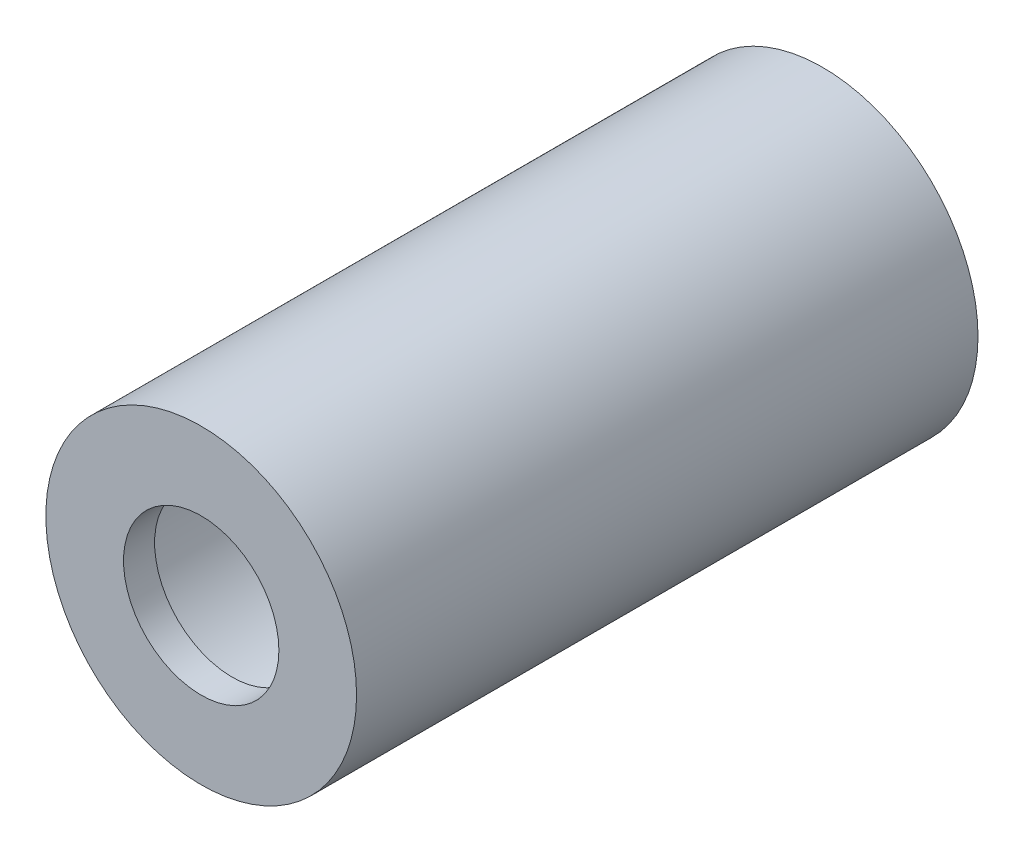
ISO-10303-21;
HEADER;
FILE_DESCRIPTION(('STEP AP214'),'2;1');
FILE_NAME('part.step','',(''),(''),'','','');
FILE_SCHEMA(('AUTOMOTIVE_DESIGN { 1 0 10303 214 1 1 1 1 }'));
ENDSEC;
DATA;
#1=APPLICATION_CONTEXT('core data for automotive mechanical design processes');
#2=APPLICATION_PROTOCOL_DEFINITION('international standard','automotive_design',2000,#1);
#3=PRODUCT_CONTEXT('',#1,'mechanical');
#4=PRODUCT('Part','Part','',(#3));
#5=PRODUCT_RELATED_PRODUCT_CATEGORY('part','',(#4));
#6=PRODUCT_DEFINITION_FORMATION('','',#4);
#7=PRODUCT_DEFINITION_CONTEXT('part definition',#1,'design');
#8=PRODUCT_DEFINITION('design','',#6,#7);
#9=PRODUCT_DEFINITION_SHAPE('','',#8);
#10=(LENGTH_UNIT() NAMED_UNIT(*) SI_UNIT(.MILLI.,.METRE.));
#11=(NAMED_UNIT(*) PLANE_ANGLE_UNIT() SI_UNIT($,.RADIAN.));
#12=(NAMED_UNIT(*) SI_UNIT($,.STERADIAN.) SOLID_ANGLE_UNIT());
#13=UNCERTAINTY_MEASURE_WITH_UNIT(LENGTH_MEASURE(1.E-05),#10,'distance_accuracy_value','');
#14=(GEOMETRIC_REPRESENTATION_CONTEXT(3) GLOBAL_UNCERTAINTY_ASSIGNED_CONTEXT((#13)) GLOBAL_UNIT_ASSIGNED_CONTEXT((#10,
#11,#12)) REPRESENTATION_CONTEXT('',''));
#15=CARTESIAN_POINT('',(0.,0.,0.));
#16=DIRECTION('',(0.,0.,1.));
#17=DIRECTION('',(1.,0.,0.));
#18=AXIS2_PLACEMENT_3D('',#15,#16,#17);
#19=CARTESIAN_POINT('',(0.,0.,19.));
#20=DIRECTION('',(0.,0.,-1.));
#21=DIRECTION('',(-1.,0.,0.));
#22=AXIS2_PLACEMENT_3D('',#19,#20,#21);
#23=CYLINDRICAL_SURFACE('',#22,4.);
#24=CARTESIAN_POINT('',(0.,0.,19.));
#25=DIRECTION('',(0.,0.,1.));
#26=DIRECTION('',(1.,0.,0.));
#27=AXIS2_PLACEMENT_3D('',#24,#25,#26);
#28=CIRCLE('',#27,4.);
#29=CARTESIAN_POINT('',(4.,0.,19.));
#30=VERTEX_POINT('',#29);
#31=EDGE_CURVE('E51',#30,#30,#28,.T.);
#32=ORIENTED_EDGE('',*,*,#31,.T.);
#33=EDGE_LOOP('',(#32));
#34=FACE_BOUND('',#33,.T.);
#35=CARTESIAN_POINT('',(0.,0.,1.));
#36=DIRECTION('',(0.,0.,1.));
#37=DIRECTION('',(1.,0.,0.));
#38=AXIS2_PLACEMENT_3D('',#35,#36,#37);
#39=CIRCLE('',#38,4.);
#40=CARTESIAN_POINT('',(4.,0.,1.));
#41=VERTEX_POINT('',#40);
#42=EDGE_CURVE('E53',#41,#41,#39,.T.);
#43=ORIENTED_EDGE('',*,*,#42,.F.);
#44=EDGE_LOOP('',(#43));
#45=FACE_BOUND('',#44,.T.);
#46=ADVANCED_FACE('F36',(#34,#45),#23,.F.);
#47=CARTESIAN_POINT('',(0.,0.,19.));
#48=DIRECTION('',(0.,0.,1.));
#49=DIRECTION('',(1.,0.,0.));
#50=AXIS2_PLACEMENT_3D('',#47,#48,#49);
#51=PLANE('',#50);
#52=CARTESIAN_POINT('',(0.,0.,19.));
#53=DIRECTION('',(0.,0.,1.));
#54=DIRECTION('',(1.,0.,0.));
#55=AXIS2_PLACEMENT_3D('',#52,#53,#54);
#56=CIRCLE('',#55,2.5);
#57=CARTESIAN_POINT('',(2.5,0.,19.));
#58=VERTEX_POINT('',#57);
#59=EDGE_CURVE('E57',#58,#58,#56,.T.);
#60=ORIENTED_EDGE('',*,*,#59,.T.);
#61=EDGE_LOOP('',(#60));
#62=FACE_BOUND('',#61,.T.);
#63=ORIENTED_EDGE('',*,*,#31,.F.);
#64=EDGE_LOOP('',(#63));
#65=FACE_BOUND('',#64,.T.);
#66=ADVANCED_FACE('F83',(#62,#65),#51,.F.);
#67=CARTESIAN_POINT('',(0.,0.,1.));
#68=DIRECTION('',(0.,0.,1.));
#69=DIRECTION('',(1.,0.,0.));
#70=AXIS2_PLACEMENT_3D('',#67,#68,#69);
#71=PLANE('',#70);
#72=CARTESIAN_POINT('',(0.,0.,1.));
#73=DIRECTION('',(0.,0.,1.));
#74=DIRECTION('',(1.,0.,0.));
#75=AXIS2_PLACEMENT_3D('',#72,#73,#74);
#76=CIRCLE('',#75,2.5);
#77=CARTESIAN_POINT('',(2.5,0.,1.));
#78=VERTEX_POINT('',#77);
#79=EDGE_CURVE('E40',#78,#78,#76,.T.);
#80=ORIENTED_EDGE('',*,*,#79,.F.);
#81=EDGE_LOOP('',(#80));
#82=FACE_BOUND('',#81,.T.);
#83=ORIENTED_EDGE('',*,*,#42,.T.);
#84=EDGE_LOOP('',(#83));
#85=FACE_BOUND('',#84,.T.);
#86=ADVANCED_FACE('F80',(#82,#85),#71,.T.);
#87=CARTESIAN_POINT('',(0.,0.,0.));
#88=DIRECTION('',(0.,0.,1.));
#89=DIRECTION('',(1.,0.,0.));
#90=AXIS2_PLACEMENT_3D('',#87,#88,#89);
#91=CYLINDRICAL_SURFACE('',#90,2.5);
#92=ORIENTED_EDGE('',*,*,#79,.T.);
#93=EDGE_LOOP('',(#92));
#94=FACE_BOUND('',#93,.T.);
#95=CARTESIAN_POINT('',(0.,0.,0.));
#96=DIRECTION('',(0.,0.,1.));
#97=DIRECTION('',(1.,0.,0.));
#98=AXIS2_PLACEMENT_3D('',#95,#96,#97);
#99=CIRCLE('',#98,2.5);
#100=CARTESIAN_POINT('',(2.5,0.,0.));
#101=VERTEX_POINT('',#100);
#102=EDGE_CURVE('E68',#101,#101,#99,.T.);
#103=ORIENTED_EDGE('',*,*,#102,.F.);
#104=EDGE_LOOP('',(#103));
#105=FACE_BOUND('',#104,.T.);
#106=ADVANCED_FACE('F77',(#94,#105),#91,.F.);
#107=CARTESIAN_POINT('',(0.,0.,20.));
#108=DIRECTION('',(0.,0.,1.));
#109=DIRECTION('',(1.,0.,0.));
#110=AXIS2_PLACEMENT_3D('',#107,#108,#109);
#111=CIRCLE('',#110,2.5);
#112=CARTESIAN_POINT('',(2.5,0.,20.));
#113=VERTEX_POINT('',#112);
#114=EDGE_CURVE('E64',#113,#113,#111,.T.);
#115=ORIENTED_EDGE('',*,*,#114,.T.);
#116=EDGE_LOOP('',(#115));
#117=FACE_BOUND('',#116,.T.);
#118=ORIENTED_EDGE('',*,*,#59,.F.);
#119=EDGE_LOOP('',(#118));
#120=FACE_BOUND('',#119,.T.);
#121=ADVANCED_FACE('F107',(#117,#120),#91,.F.);
#122=CARTESIAN_POINT('',(0.,0.,20.));
#123=DIRECTION('',(0.,0.,-1.));
#124=DIRECTION('',(-1.,0.,0.));
#125=AXIS2_PLACEMENT_3D('',#122,#123,#124);
#126=CYLINDRICAL_SURFACE('',#125,5.);
#127=CARTESIAN_POINT('',(0.,0.,20.));
#128=DIRECTION('',(0.,0.,1.));
#129=DIRECTION('',(1.,0.,0.));
#130=AXIS2_PLACEMENT_3D('',#127,#128,#129);
#131=CIRCLE('',#130,5.);
#132=CARTESIAN_POINT('',(5.,0.,20.));
#133=VERTEX_POINT('',#132);
#134=EDGE_CURVE('E10',#133,#133,#131,.T.);
#135=ORIENTED_EDGE('',*,*,#134,.F.);
#136=EDGE_LOOP('',(#135));
#137=FACE_BOUND('',#136,.T.);
#138=CARTESIAN_POINT('',(0.,0.,0.));
#139=DIRECTION('',(0.,0.,1.));
#140=DIRECTION('',(1.,0.,0.));
#141=AXIS2_PLACEMENT_3D('',#138,#139,#140);
#142=CIRCLE('',#141,5.);
#143=CARTESIAN_POINT('',(5.,0.,0.));
#144=VERTEX_POINT('',#143);
#145=EDGE_CURVE('E45',#144,#144,#142,.T.);
#146=ORIENTED_EDGE('',*,*,#145,.T.);
#147=EDGE_LOOP('',(#146));
#148=FACE_BOUND('',#147,.T.);
#149=ADVANCED_FACE('F38',(#137,#148),#126,.T.);
#150=CARTESIAN_POINT('',(0.,0.,20.));
#151=DIRECTION('',(0.,0.,1.));
#152=DIRECTION('',(1.,0.,0.));
#153=AXIS2_PLACEMENT_3D('',#150,#151,#152);
#154=PLANE('',#153);
#155=ORIENTED_EDGE('',*,*,#114,.F.);
#156=EDGE_LOOP('',(#155));
#157=FACE_BOUND('',#156,.T.);
#158=ORIENTED_EDGE('',*,*,#134,.T.);
#159=EDGE_LOOP('',(#158));
#160=FACE_BOUND('',#159,.T.);
#161=ADVANCED_FACE('F96',(#157,#160),#154,.T.);
#162=CARTESIAN_POINT('',(0.,0.,0.));
#163=DIRECTION('',(0.,0.,1.));
#164=DIRECTION('',(1.,0.,0.));
#165=AXIS2_PLACEMENT_3D('',#162,#163,#164);
#166=PLANE('',#165);
#167=ORIENTED_EDGE('',*,*,#102,.T.);
#168=EDGE_LOOP('',(#167));
#169=FACE_BOUND('',#168,.T.);
#170=ORIENTED_EDGE('',*,*,#145,.F.);
#171=EDGE_LOOP('',(#170));
#172=FACE_BOUND('',#171,.T.);
#173=ADVANCED_FACE('F98',(#169,#172),#166,.F.);
#174=CLOSED_SHELL('',(#46,#66,#86,#106,#121,#149,#161,#173));
#175=MANIFOLD_SOLID_BREP('B2',#174);
#176=ADVANCED_BREP_SHAPE_REPRESENTATION('',(#18,#175),#14);
#177=SHAPE_DEFINITION_REPRESENTATION(#9,#176);
ENDSEC;
END-ISO-10303-21;
